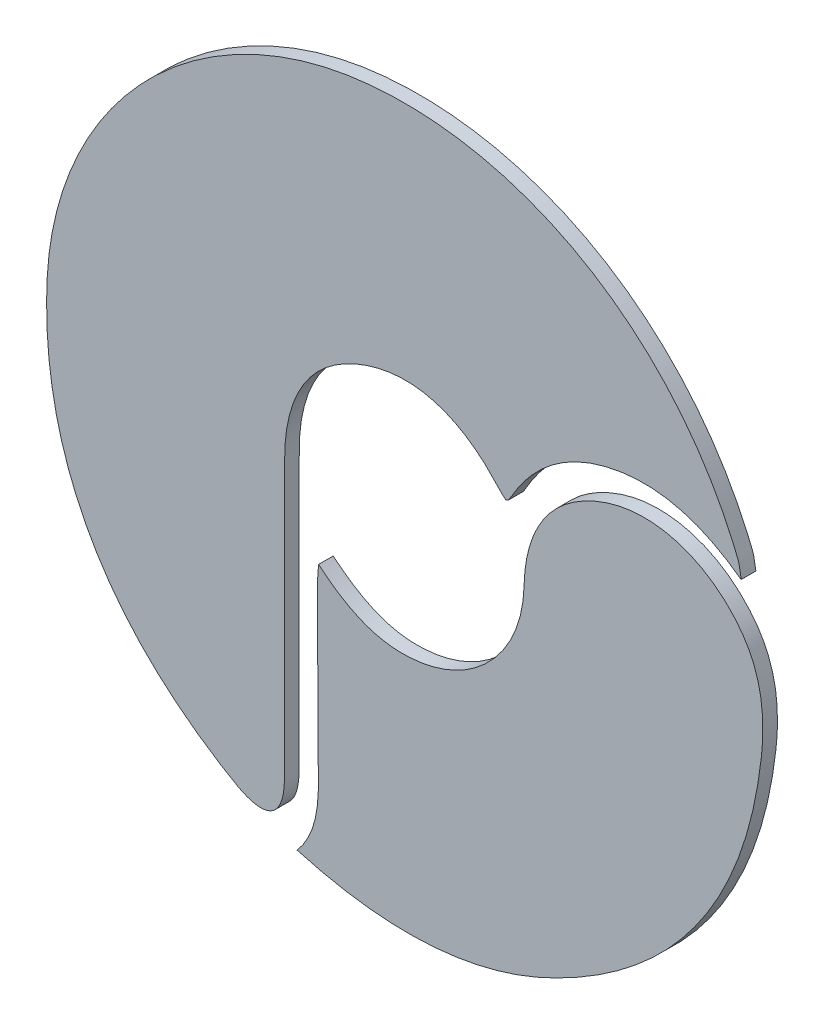
ISO-10303-21;
HEADER;
FILE_DESCRIPTION(('STEP AP214'),'2;1');
FILE_NAME('part.step','',(''),(''),'','','');
FILE_SCHEMA(('AUTOMOTIVE_DESIGN { 1 0 10303 214 1 1 1 1 }'));
ENDSEC;
DATA;
#1=APPLICATION_CONTEXT('core data for automotive mechanical design processes');
#2=APPLICATION_PROTOCOL_DEFINITION('international standard','automotive_design',2000,#1);
#3=PRODUCT_CONTEXT('',#1,'mechanical');
#4=PRODUCT('Part','Part','',(#3));
#5=PRODUCT_RELATED_PRODUCT_CATEGORY('part','',(#4));
#6=PRODUCT_DEFINITION_FORMATION('','',#4);
#7=PRODUCT_DEFINITION_CONTEXT('part definition',#1,'design');
#8=PRODUCT_DEFINITION('design','',#6,#7);
#9=PRODUCT_DEFINITION_SHAPE('','',#8);
#10=(LENGTH_UNIT() NAMED_UNIT(*) SI_UNIT(.MILLI.,.METRE.));
#11=(NAMED_UNIT(*) PLANE_ANGLE_UNIT() SI_UNIT($,.RADIAN.));
#12=(NAMED_UNIT(*) SI_UNIT($,.STERADIAN.) SOLID_ANGLE_UNIT());
#13=UNCERTAINTY_MEASURE_WITH_UNIT(LENGTH_MEASURE(1.E-05),#10,'distance_accuracy_value','');
#14=(GEOMETRIC_REPRESENTATION_CONTEXT(3) GLOBAL_UNCERTAINTY_ASSIGNED_CONTEXT((#13)) GLOBAL_UNIT_ASSIGNED_CONTEXT((#10,
#11,#12)) REPRESENTATION_CONTEXT('',''));
#15=CARTESIAN_POINT('',(0.,0.,0.));
#16=DIRECTION('',(0.,0.,1.));
#17=DIRECTION('',(1.,0.,0.));
#18=AXIS2_PLACEMENT_3D('',#15,#16,#17);
#19=CARTESIAN_POINT('',(10.8886265670865,-16.6988489602994,0.5));
#20=CARTESIAN_POINT('',(10.8735191148628,-16.9151184245698,0.5));
#21=CARTESIAN_POINT('',(10.8564087807155,-17.0439732199982,0.5));
#22=CARTESIAN_POINT('',(10.8567357818459,-17.1727844152745,0.5));
#23=CARTESIAN_POINT('',(10.8615644985378,-19.0755912762643,0.5));
#24=CARTESIAN_POINT('',(10.8482646358962,-20.9787778219001,0.5));
#25=CARTESIAN_POINT('',(10.884044009579,-22.8810305976409,0.5));
#26=CARTESIAN_POINT('',(10.9015885285602,-23.8137867886757,0.5));
#27=CARTESIAN_POINT('',(10.8334051595296,-24.7013786735861,0.5));
#28=CARTESIAN_POINT('',(10.1593486461056,-25.5016176565321,0.5));
#29=B_SPLINE_CURVE_WITH_KNOTS('',3,(#19,#20,#21,#22,#23,#24,#25,#26,#27,#28),.UNSPECIFIED.,.F.,
.F.,(4,3,3,4),(7.,8.,9.,10.),.UNSPECIFIED.);
#30=DIRECTION('',(0.,0.,-1.));
#31=VECTOR('',#30,1.);
#32=SURFACE_OF_LINEAR_EXTRUSION('',#29,#31);
#33=CARTESIAN_POINT('',(10.8886265670865,-16.6988489602994,0.));
#34=CARTESIAN_POINT('',(10.8735191148628,-16.9151184245698,0.));
#35=CARTESIAN_POINT('',(10.8564087807155,-17.0439732199982,0.));
#36=CARTESIAN_POINT('',(10.8567357818459,-17.1727844152745,0.));
#37=CARTESIAN_POINT('',(10.8615644985378,-19.0755912762643,0.));
#38=CARTESIAN_POINT('',(10.8482646358962,-20.9787778219001,0.));
#39=CARTESIAN_POINT('',(10.884044009579,-22.8810305976409,0.));
#40=CARTESIAN_POINT('',(10.9015885285602,-23.8137867886757,0.));
#41=CARTESIAN_POINT('',(10.8334051595296,-24.7013786735861,0.));
#42=CARTESIAN_POINT('',(10.1593486461056,-25.5016176565321,0.));
#43=B_SPLINE_CURVE_WITH_KNOTS('',3,(#33,#34,#35,#36,#37,#38,#39,#40,#41,#42),.UNSPECIFIED.,.F.,
.F.,(4,3,3,4),(7.,8.,9.,10.),.UNSPECIFIED.);
#44=CARTESIAN_POINT('',(10.8886265670865,-16.6988489602994,0.));
#45=VERTEX_POINT('',#44);
#46=CARTESIAN_POINT('',(10.1593486461056,-25.5016176565321,0.));
#47=VERTEX_POINT('',#46);
#48=EDGE_CURVE('E116',#45,#47,#43,.T.);
#49=ORIENTED_EDGE('',*,*,#48,.T.);
#50=DIRECTION('',(0.,0.,-1.));
#51=VECTOR('',#50,1.);
#52=CARTESIAN_POINT('',(10.1593486461056,-25.5016176565321,0.5));
#53=LINE('',#52,#51);
#54=CARTESIAN_POINT('',(10.1593486461056,-25.5016176565321,0.5));
#55=VERTEX_POINT('',#54);
#56=EDGE_CURVE('E13',#55,#47,#53,.T.);
#57=ORIENTED_EDGE('',*,*,#56,.F.);
#58=CARTESIAN_POINT('',(10.8886265670865,-16.6988489602994,0.5));
#59=VERTEX_POINT('',#58);
#60=EDGE_CURVE('E115',#59,#55,#29,.T.);
#61=ORIENTED_EDGE('',*,*,#60,.F.);
#62=DIRECTION('',(0.,0.,-1.));
#63=VECTOR('',#62,1.);
#64=CARTESIAN_POINT('',(10.8886265670865,-16.6988489602994,0.5));
#65=LINE('',#64,#63);
#66=EDGE_CURVE('E93',#59,#45,#65,.T.);
#67=ORIENTED_EDGE('',*,*,#66,.T.);
#68=EDGE_LOOP('',(#49,#57,#61,#67));
#69=FACE_BOUND('',#68,.T.);
#70=ADVANCED_FACE('F84',(#69),#32,.F.);
#71=CARTESIAN_POINT('',(10.1593486461056,-25.5016176565321,0.5));
#72=CARTESIAN_POINT('',(13.1319778552765,-26.35100127603,0.5));
#73=CARTESIAN_POINT('',(16.0125426211964,-26.2781781242936,0.5));
#74=CARTESIAN_POINT('',(18.7311173854809,-24.9866290263102,0.5));
#75=CARTESIAN_POINT('',(22.9556068387708,-22.9796450552,0.5));
#76=CARTESIAN_POINT('',(25.4391640739751,-19.6118676800737,0.5));
#77=CARTESIAN_POINT('',(25.9782272540847,-14.9154583704432,0.5));
#78=CARTESIAN_POINT('',(26.1246583602701,-13.639715235432,0.5));
#79=CARTESIAN_POINT('',(26.0503582534288,-12.3679587892017,0.5));
#80=CARTESIAN_POINT('',(25.1798866943671,-11.3029297325906,0.5));
#81=CARTESIAN_POINT('',(24.0527174312817,-9.92382517361093,0.5));
#82=CARTESIAN_POINT('',(22.270975472125,-9.41798894169419,0.5));
#83=CARTESIAN_POINT('',(20.6364803053068,-9.99366625670557,0.5));
#84=CARTESIAN_POINT('',(18.8917603241271,-10.6081649642488,0.5));
#85=CARTESIAN_POINT('',(17.941476872504,-11.9364744393058,0.5));
#86=CARTESIAN_POINT('',(17.8973353532484,-13.8224471004359,0.5));
#87=CARTESIAN_POINT('',(17.8437653013994,-16.111258812441,0.5));
#88=CARTESIAN_POINT('',(16.0000875114751,-17.9129006070542,0.5));
#89=CARTESIAN_POINT('',(13.7263323848516,-17.9001475629699,0.5));
#90=CARTESIAN_POINT('',(12.6481251826857,-17.8940980420578,0.5));
#91=CARTESIAN_POINT('',(11.7549206867075,-17.424348201551,0.5));
#92=CARTESIAN_POINT('',(10.8886265670865,-16.6988489602994,0.5));
#93=B_SPLINE_CURVE_WITH_KNOTS('',3,(#71,#72,#73,#74,#75,#76,#77,#78,#79,#80,#81,#82,#83,#84,#85,
#86,#87,#88,#89,#90,#91,#92),.UNSPECIFIED.,.F.,.F.,(4,3,3,3,3,3,3,4),(0.,1.,2.,3.,4.,5.,6.,7.),.UNSPECIFIED.);
#94=DIRECTION('',(0.,0.,-1.));
#95=VECTOR('',#94,1.);
#96=SURFACE_OF_LINEAR_EXTRUSION('',#93,#95);
#97=CARTESIAN_POINT('',(10.1593486461056,-25.5016176565321,0.));
#98=CARTESIAN_POINT('',(13.1319778552765,-26.35100127603,0.));
#99=CARTESIAN_POINT('',(16.0125426211964,-26.2781781242936,0.));
#100=CARTESIAN_POINT('',(18.7311173854809,-24.9866290263102,0.));
#101=CARTESIAN_POINT('',(22.9556068387708,-22.9796450552,0.));
#102=CARTESIAN_POINT('',(25.4391640739751,-19.6118676800737,0.));
#103=CARTESIAN_POINT('',(25.9782272540847,-14.9154583704432,0.));
#104=CARTESIAN_POINT('',(26.1246583602701,-13.639715235432,0.));
#105=CARTESIAN_POINT('',(26.0503582534288,-12.3679587892017,0.));
#106=CARTESIAN_POINT('',(25.1798866943671,-11.3029297325906,0.));
#107=CARTESIAN_POINT('',(24.0527174312817,-9.92382517361093,0.));
#108=CARTESIAN_POINT('',(22.270975472125,-9.41798894169419,0.));
#109=CARTESIAN_POINT('',(20.6364803053068,-9.99366625670557,0.));
#110=CARTESIAN_POINT('',(18.8917603241271,-10.6081649642488,0.));
#111=CARTESIAN_POINT('',(17.941476872504,-11.9364744393058,0.));
#112=CARTESIAN_POINT('',(17.8973353532484,-13.8224471004359,0.));
#113=CARTESIAN_POINT('',(17.8437653013994,-16.111258812441,0.));
#114=CARTESIAN_POINT('',(16.0000875114751,-17.9129006070542,0.));
#115=CARTESIAN_POINT('',(13.7263323848516,-17.9001475629699,0.));
#116=CARTESIAN_POINT('',(12.6481251826857,-17.8940980420578,0.));
#117=CARTESIAN_POINT('',(11.7549206867075,-17.424348201551,0.));
#118=CARTESIAN_POINT('',(10.8886265670865,-16.6988489602994,0.));
#119=B_SPLINE_CURVE_WITH_KNOTS('',3,(#97,#98,#99,#100,#101,#102,#103,#104,#105,#106,#107,#108,
#109,#110,#111,#112,#113,#114,#115,#116,#117,#118),.UNSPECIFIED.,.F.,.F.,(4,3,3,3,3,3,3,4),(0.,
1.,2.,3.,4.,5.,6.,7.),.UNSPECIFIED.);
#120=EDGE_CURVE('E108',#47,#45,#119,.T.);
#121=ORIENTED_EDGE('',*,*,#120,.T.);
#122=ORIENTED_EDGE('',*,*,#66,.F.);
#123=EDGE_CURVE('E100',#55,#59,#93,.T.);
#124=ORIENTED_EDGE('',*,*,#123,.F.);
#125=ORIENTED_EDGE('',*,*,#56,.T.);
#126=EDGE_LOOP('',(#121,#122,#124,#125));
#127=FACE_BOUND('',#126,.T.);
#128=ADVANCED_FACE('F111',(#127),#96,.F.);
#129=CARTESIAN_POINT('',(0.,0.,0.5));
#130=DIRECTION('',(0.,0.,1.));
#131=DIRECTION('',(1.,0.,0.));
#132=AXIS2_PLACEMENT_3D('',#129,#130,#131);
#133=PLANE('',#132);
#134=ORIENTED_EDGE('',*,*,#60,.T.);
#135=ORIENTED_EDGE('',*,*,#123,.T.);
#136=EDGE_LOOP('',(#134,#135));
#137=FACE_BOUND('',#136,.T.);
#138=ADVANCED_FACE('F143',(#137),#133,.T.);
#139=CARTESIAN_POINT('',(0.,0.,0.));
#140=DIRECTION('',(0.,0.,1.));
#141=DIRECTION('',(1.,0.,0.));
#142=AXIS2_PLACEMENT_3D('',#139,#140,#141);
#143=PLANE('',#142);
#144=ORIENTED_EDGE('',*,*,#48,.F.);
#145=ORIENTED_EDGE('',*,*,#120,.F.);
#146=EDGE_LOOP('',(#144,#145));
#147=FACE_BOUND('',#146,.T.);
#148=ADVANCED_FACE('F119',(#147),#143,.F.);
#149=CLOSED_SHELL('',(#70,#128,#138,#148));
#150=MANIFOLD_SOLID_BREP('B2',#149);
#151=CARTESIAN_POINT('',(19.1929645059164,-16.8817275198224,0.5));
#152=DIRECTION('',(0.750870290810549,-0.660449700112039,0.));
#153=DIRECTION('',(0.660449700112039,0.750870290810549,0.));
#154=AXIS2_PLACEMENT_3D('',#151,#152,#153);
#155=PLANE('',#154);
#156=DIRECTION('',(-0.660449700112039,-0.750870290810549,0.));
#157=VECTOR('',#156,1.);
#158=CARTESIAN_POINT('',(19.1929645059164,-16.8817275198224,0.));
#159=LINE('',#158,#157);
#160=CARTESIAN_POINT('',(25.3017236822025,-9.93663271788451,0.));
#161=VERTEX_POINT('',#160);
#162=CARTESIAN_POINT('',(25.2979384704392,-9.94093615394779,0.));
#163=VERTEX_POINT('',#162);
#164=EDGE_CURVE('E225',#161,#163,#159,.T.);
#165=ORIENTED_EDGE('',*,*,#164,.F.);
#166=DIRECTION('',(0.,0.,-1.));
#167=VECTOR('',#166,1.);
#168=CARTESIAN_POINT('',(25.3017236822025,-9.93663271788451,0.5));
#169=LINE('',#168,#167);
#170=CARTESIAN_POINT('',(25.3017236822025,-9.93663271788451,0.5));
#171=VERTEX_POINT('',#170);
#172=EDGE_CURVE('E82',#171,#161,#169,.T.);
#173=ORIENTED_EDGE('',*,*,#172,.F.);
#174=DIRECTION('',(-0.660449700112039,-0.750870290810549,0.));
#175=VECTOR('',#174,1.);
#176=CARTESIAN_POINT('',(19.1929645059164,-16.8817275198224,0.5));
#177=LINE('',#176,#175);
#178=CARTESIAN_POINT('',(25.2979384704392,-9.94093615394779,0.5));
#179=VERTEX_POINT('',#178);
#180=EDGE_CURVE('E223',#171,#179,#177,.T.);
#181=ORIENTED_EDGE('',*,*,#180,.T.);
#182=DIRECTION('',(0.,0.,-1.));
#183=VECTOR('',#182,1.);
#184=CARTESIAN_POINT('',(25.2979384704392,-9.94093615394779,0.5));
#185=LINE('',#184,#183);
#186=EDGE_CURVE('E219',#179,#163,#185,.T.);
#187=ORIENTED_EDGE('',*,*,#186,.T.);
#188=EDGE_LOOP('',(#165,#173,#181,#187));
#189=FACE_BOUND('',#188,.T.);
#190=ADVANCED_FACE('F184',(#189),#155,.T.);
#191=CARTESIAN_POINT('',(25.3017236822025,-9.93663271788451,0.5));
#192=CARTESIAN_POINT('',(25.2626125303349,-9.74749708074378,0.5));
#193=CARTESIAN_POINT('',(25.2513909415441,-9.54712168808233,0.5));
#194=CARTESIAN_POINT('',(25.1803426792768,-9.37085990377755,0.5));
#195=CARTESIAN_POINT('',(22.9839923535604,-3.9219633137688,0.5));
#196=CARTESIAN_POINT('',(17.7372301497934,-1.03431670253427,0.5));
#197=CARTESIAN_POINT('',(12.2755182946518,-1.7012048515951,0.5));
#198=CARTESIAN_POINT('',(6.59414252183809,-2.39491458712334,0.5));
#199=CARTESIAN_POINT('',(1.89037693573649,-7.26238477349684,0.5));
#200=CARTESIAN_POINT('',(1.63272161798581,-12.9300482989094,0.5));
#201=CARTESIAN_POINT('',(1.39932410700647,-18.0641095630897,0.5));
#202=CARTESIAN_POINT('',(3.56782381457292,-21.9674257728092,0.5));
#203=CARTESIAN_POINT('',(8.01964218286402,-24.5662091229955,0.5));
#204=CARTESIAN_POINT('',(9.10669567394315,-25.2007838832714,0.5));
#205=CARTESIAN_POINT('',(9.72570336373986,-24.8267727070501,0.5));
#206=CARTESIAN_POINT('',(9.72624564061448,-23.5786984093512,0.5));
#207=CARTESIAN_POINT('',(9.7276072369879,-20.4439820065417,0.5));
#208=CARTESIAN_POINT('',(9.72180296692332,-17.3092528870214,0.5));
#209=CARTESIAN_POINT('',(9.72856099028452,-14.1745510175953,0.5));
#210=CARTESIAN_POINT('',(9.73297187219898,-12.1286584536507,0.5));
#211=CARTESIAN_POINT('',(10.6518786570256,-10.7058828937085,0.5));
#212=CARTESIAN_POINT('',(12.3608228978676,-10.0621620934829,0.5));
#213=CARTESIAN_POINT('',(14.0980818032546,-9.40777651472477,0.5));
#214=CARTESIAN_POINT('',(15.7438548757257,-9.8865570364486,0.5));
#215=CARTESIAN_POINT('',(17.0910595661,-11.4357766668181,0.5));
#216=CARTESIAN_POINT('',(17.1494801347154,-11.502958140719,0.5));
#217=CARTESIAN_POINT('',(17.2248230118295,-11.5554236554159,0.5));
#218=CARTESIAN_POINT('',(17.2789453322532,-11.6030150365976,0.5));
#219=B_SPLINE_CURVE_WITH_KNOTS('',3,(#191,#192,#193,#194,#195,#196,#197,#198,#199,#200,#201,
#202,#203,#204,#205,#206,#207,#208,#209,#210,#211,#212,#213,#214,#215,#216,#217,#218),
.UNSPECIFIED.,.F.,.F.,(4,3,3,3,3,3,3,3,3,4),(2.,3.,4.,5.,6.,7.,8.,9.,10.,11.),.UNSPECIFIED.);
#220=DIRECTION('',(0.,0.,-1.));
#221=VECTOR('',#220,1.);
#222=SURFACE_OF_LINEAR_EXTRUSION('',#219,#221);
#223=CARTESIAN_POINT('',(25.3017236822025,-9.93663271788451,0.));
#224=CARTESIAN_POINT('',(25.2626125303349,-9.74749708074378,0.));
#225=CARTESIAN_POINT('',(25.2513909415441,-9.54712168808233,0.));
#226=CARTESIAN_POINT('',(25.1803426792768,-9.37085990377755,0.));
#227=CARTESIAN_POINT('',(22.9839923535604,-3.9219633137688,0.));
#228=CARTESIAN_POINT('',(17.7372301497934,-1.03431670253427,0.));
#229=CARTESIAN_POINT('',(12.2755182946518,-1.7012048515951,0.));
#230=CARTESIAN_POINT('',(6.59414252183809,-2.39491458712334,0.));
#231=CARTESIAN_POINT('',(1.89037693573649,-7.26238477349684,0.));
#232=CARTESIAN_POINT('',(1.63272161798581,-12.9300482989094,0.));
#233=CARTESIAN_POINT('',(1.39932410700647,-18.0641095630897,0.));
#234=CARTESIAN_POINT('',(3.56782381457292,-21.9674257728092,0.));
#235=CARTESIAN_POINT('',(8.01964218286402,-24.5662091229955,0.));
#236=CARTESIAN_POINT('',(9.10669567394315,-25.2007838832714,0.));
#237=CARTESIAN_POINT('',(9.72570336373986,-24.8267727070501,0.));
#238=CARTESIAN_POINT('',(9.72624564061448,-23.5786984093512,0.));
#239=CARTESIAN_POINT('',(9.7276072369879,-20.4439820065417,0.));
#240=CARTESIAN_POINT('',(9.72180296692332,-17.3092528870214,0.));
#241=CARTESIAN_POINT('',(9.72856099028452,-14.1745510175953,0.));
#242=CARTESIAN_POINT('',(9.73297187219898,-12.1286584536507,0.));
#243=CARTESIAN_POINT('',(10.6518786570256,-10.7058828937085,0.));
#244=CARTESIAN_POINT('',(12.3608228978676,-10.0621620934829,0.));
#245=CARTESIAN_POINT('',(14.0980818032546,-9.40777651472477,0.));
#246=CARTESIAN_POINT('',(15.7438548757257,-9.8865570364486,0.));
#247=CARTESIAN_POINT('',(17.0910595661,-11.4357766668181,0.));
#248=CARTESIAN_POINT('',(17.1494801347154,-11.502958140719,0.));
#249=CARTESIAN_POINT('',(17.2248230118295,-11.5554236554159,0.));
#250=CARTESIAN_POINT('',(17.2789453322532,-11.6030150365976,0.));
#251=B_SPLINE_CURVE_WITH_KNOTS('',3,(#223,#224,#225,#226,#227,#228,#229,#230,#231,#232,#233,
#234,#235,#236,#237,#238,#239,#240,#241,#242,#243,#244,#245,#246,#247,#248,#249,#250),
.UNSPECIFIED.,.F.,.F.,(4,3,3,3,3,3,3,3,3,4),(2.,3.,4.,5.,6.,7.,8.,9.,10.,11.),.UNSPECIFIED.);
#252=CARTESIAN_POINT('',(17.2789453322532,-11.6030150365976,0.));
#253=VERTEX_POINT('',#252);
#254=EDGE_CURVE('E213',#161,#253,#251,.T.);
#255=ORIENTED_EDGE('',*,*,#254,.T.);
#256=DIRECTION('',(0.,0.,-1.));
#257=VECTOR('',#256,1.);
#258=CARTESIAN_POINT('',(17.2789453322532,-11.6030150365976,0.5));
#259=LINE('',#258,#257);
#260=CARTESIAN_POINT('',(17.2789453322532,-11.6030150365976,0.5));
#261=VERTEX_POINT('',#260);
#262=EDGE_CURVE('E193',#261,#253,#259,.T.);
#263=ORIENTED_EDGE('',*,*,#262,.F.);
#264=EDGE_CURVE('E226',#171,#261,#219,.T.);
#265=ORIENTED_EDGE('',*,*,#264,.F.);
#266=ORIENTED_EDGE('',*,*,#172,.T.);
#267=EDGE_LOOP('',(#255,#263,#265,#266));
#268=FACE_BOUND('',#267,.T.);
#269=ADVANCED_FACE('F227',(#268),#222,.F.);
#270=CARTESIAN_POINT('',(17.2789453322532,-11.6030150365976,0.5));
#271=CARTESIAN_POINT('',(17.339549541751,-11.5703230985874,0.5));
#272=CARTESIAN_POINT('',(17.3630009728183,-11.5654671318011,0.5));
#273=CARTESIAN_POINT('',(17.3723295883987,-11.5513061661827,0.5));
#274=CARTESIAN_POINT('',(17.4155991046402,-11.4856225391261,0.5));
#275=CARTESIAN_POINT('',(17.4558202436783,-11.4178679049111,0.5));
#276=CARTESIAN_POINT('',(17.4955708644214,-11.3499415951021,0.5));
#277=CARTESIAN_POINT('',(18.3026641543959,-9.97083340277658,0.5));
#278=CARTESIAN_POINT('',(19.4787600532781,-9.11476987685456,0.5));
#279=CARTESIAN_POINT('',(21.0610603896692,-8.8350249514935,0.5));
#280=CARTESIAN_POINT('',(22.6424033394165,-8.55544716004414,0.5));
#281=CARTESIAN_POINT('',(24.0339184996308,-9.0042316864106,0.5));
#282=CARTESIAN_POINT('',(25.2979377357815,-9.94093550775827,0.5));
#283=B_SPLINE_CURVE_WITH_KNOTS('',3,(#270,#271,#272,#273,#274,#275,#276,#277,#278,#279,#280,
#281,#282),.UNSPECIFIED.,.F.,.F.,(4,3,3,3,4),(11.,12.,13.,14.,15.),.UNSPECIFIED.);
#284=DIRECTION('',(0.,0.,-1.));
#285=VECTOR('',#284,1.);
#286=SURFACE_OF_LINEAR_EXTRUSION('',#283,#285);
#287=CARTESIAN_POINT('',(17.2789453322532,-11.6030150365976,0.));
#288=CARTESIAN_POINT('',(17.339549541751,-11.5703230985874,0.));
#289=CARTESIAN_POINT('',(17.3630009728183,-11.5654671318011,0.));
#290=CARTESIAN_POINT('',(17.3723295883987,-11.5513061661827,0.));
#291=CARTESIAN_POINT('',(17.4155991046402,-11.4856225391261,0.));
#292=CARTESIAN_POINT('',(17.4558202436783,-11.4178679049111,0.));
#293=CARTESIAN_POINT('',(17.4955708644214,-11.3499415951021,0.));
#294=CARTESIAN_POINT('',(18.3026641543959,-9.97083340277658,0.));
#295=CARTESIAN_POINT('',(19.4787600532781,-9.11476987685456,0.));
#296=CARTESIAN_POINT('',(21.0610603896692,-8.8350249514935,0.));
#297=CARTESIAN_POINT('',(22.6424033394165,-8.55544716004414,0.));
#298=CARTESIAN_POINT('',(24.0339184996308,-9.0042316864106,0.));
#299=CARTESIAN_POINT('',(25.2979377357815,-9.94093550775827,0.));
#300=B_SPLINE_CURVE_WITH_KNOTS('',3,(#287,#288,#289,#290,#291,#292,#293,#294,#295,#296,#297,
#298,#299),.UNSPECIFIED.,.F.,.F.,(4,3,3,3,4),(11.,12.,13.,14.,15.),.UNSPECIFIED.);
#301=EDGE_CURVE('E232',#253,#163,#300,.T.);
#302=ORIENTED_EDGE('',*,*,#301,.T.);
#303=ORIENTED_EDGE('',*,*,#186,.F.);
#304=EDGE_CURVE('E201',#261,#179,#283,.T.);
#305=ORIENTED_EDGE('',*,*,#304,.F.);
#306=ORIENTED_EDGE('',*,*,#262,.T.);
#307=EDGE_LOOP('',(#302,#303,#305,#306));
#308=FACE_BOUND('',#307,.T.);
#309=ADVANCED_FACE('F249',(#308),#286,.F.);
#310=CARTESIAN_POINT('',(0.,0.,0.5));
#311=DIRECTION('',(0.,0.,1.));
#312=DIRECTION('',(1.,0.,0.));
#313=AXIS2_PLACEMENT_3D('',#310,#311,#312);
#314=PLANE('',#313);
#315=ORIENTED_EDGE('',*,*,#180,.F.);
#316=ORIENTED_EDGE('',*,*,#264,.T.);
#317=ORIENTED_EDGE('',*,*,#304,.T.);
#318=EDGE_LOOP('',(#315,#316,#317));
#319=FACE_BOUND('',#318,.T.);
#320=ADVANCED_FACE('F230',(#319),#314,.T.);
#321=CARTESIAN_POINT('',(0.,0.,0.));
#322=DIRECTION('',(0.,0.,1.));
#323=DIRECTION('',(1.,0.,0.));
#324=AXIS2_PLACEMENT_3D('',#321,#322,#323);
#325=PLANE('',#324);
#326=ORIENTED_EDGE('',*,*,#164,.T.);
#327=ORIENTED_EDGE('',*,*,#301,.F.);
#328=ORIENTED_EDGE('',*,*,#254,.F.);
#329=EDGE_LOOP('',(#326,#327,#328));
#330=FACE_BOUND('',#329,.T.);
#331=ADVANCED_FACE('F253',(#330),#325,.F.);
#332=CLOSED_SHELL('',(#190,#269,#309,#320,#331));
#333=MANIFOLD_SOLID_BREP('B7',#332);
#334=ADVANCED_BREP_SHAPE_REPRESENTATION('',(#18,#150,#333),#14);
#335=SHAPE_DEFINITION_REPRESENTATION(#9,#334);
ENDSEC;
END-ISO-10303-21;
